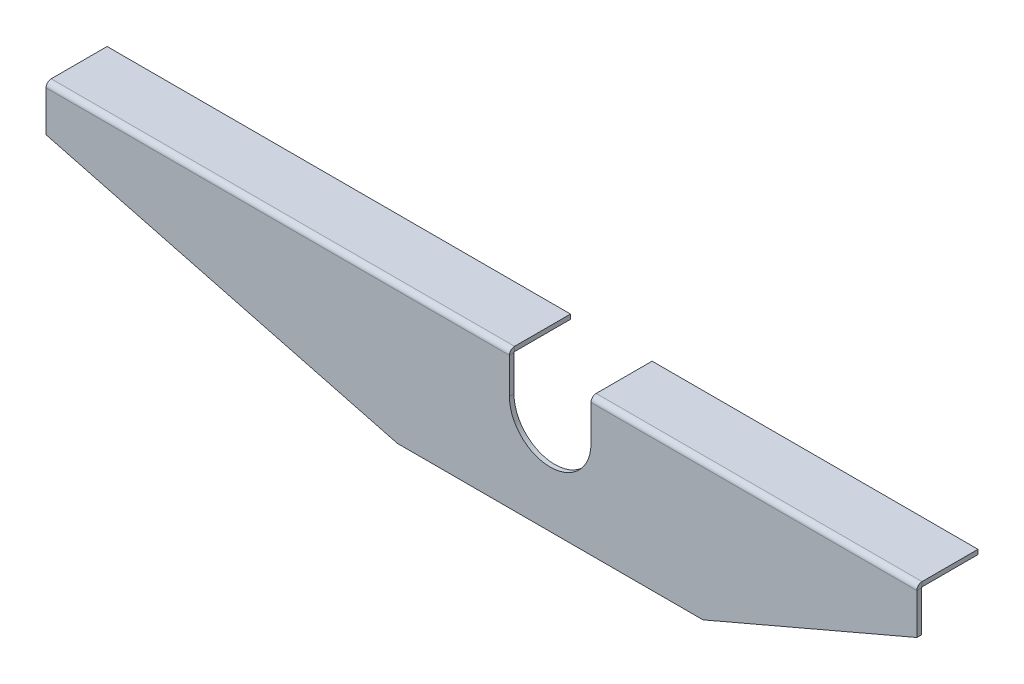
ISO-10303-21;
HEADER;
FILE_DESCRIPTION(('STEP AP214'),'2;1');
FILE_NAME('part.step','',(''),(''),'','','');
FILE_SCHEMA(('AUTOMOTIVE_DESIGN { 1 0 10303 214 1 1 1 1 }'));
ENDSEC;
DATA;
#1=APPLICATION_CONTEXT('core data for automotive mechanical design processes');
#2=APPLICATION_PROTOCOL_DEFINITION('international standard','automotive_design',2000,#1);
#3=PRODUCT_CONTEXT('',#1,'mechanical');
#4=PRODUCT('Part','Part','',(#3));
#5=PRODUCT_RELATED_PRODUCT_CATEGORY('part','',(#4));
#6=PRODUCT_DEFINITION_FORMATION('','',#4);
#7=PRODUCT_DEFINITION_CONTEXT('part definition',#1,'design');
#8=PRODUCT_DEFINITION('design','',#6,#7);
#9=PRODUCT_DEFINITION_SHAPE('','',#8);
#10=(LENGTH_UNIT() NAMED_UNIT(*) SI_UNIT(.MILLI.,.METRE.));
#11=(NAMED_UNIT(*) PLANE_ANGLE_UNIT() SI_UNIT($,.RADIAN.));
#12=(NAMED_UNIT(*) SI_UNIT($,.STERADIAN.) SOLID_ANGLE_UNIT());
#13=UNCERTAINTY_MEASURE_WITH_UNIT(LENGTH_MEASURE(1.E-05),#10,'distance_accuracy_value','');
#14=(GEOMETRIC_REPRESENTATION_CONTEXT(3) GLOBAL_UNCERTAINTY_ASSIGNED_CONTEXT((#13)) GLOBAL_UNIT_ASSIGNED_CONTEXT((#10,
#11,#12)) REPRESENTATION_CONTEXT('',''));
#15=CARTESIAN_POINT('',(0.,0.,0.));
#16=DIRECTION('',(0.,0.,1.));
#17=DIRECTION('',(1.,0.,0.));
#18=AXIS2_PLACEMENT_3D('',#15,#16,#17);
#19=CARTESIAN_POINT('',(0.,0.,-1.5));
#20=DIRECTION('',(0.,0.,1.));
#21=DIRECTION('',(1.,0.,0.));
#22=AXIS2_PLACEMENT_3D('',#19,#20,#21);
#23=PLANE('',#22);
#24=DIRECTION('',(1.,0.,0.));
#25=VECTOR('',#24,1.);
#26=CARTESIAN_POINT('',(120.,11.65,-1.5));
#27=LINE('',#26,#25);
#28=CARTESIAN_POINT('',(120.,11.65,-1.5));
#29=VERTEX_POINT('',#28);
#30=CARTESIAN_POINT('',(13.35,11.65,-1.5));
#31=VERTEX_POINT('',#30);
#32=EDGE_CURVE('E590',#29,#31,#27,.F.);
#33=ORIENTED_EDGE('',*,*,#32,.F.);
#34=DIRECTION('',(0.,1.,0.));
#35=VECTOR('',#34,1.);
#36=CARTESIAN_POINT('',(120.,13.35,-1.5));
#37=LINE('',#36,#35);
#38=CARTESIAN_POINT('',(120.,-1.65,-1.5));
#39=VERTEX_POINT('',#38);
#40=EDGE_CURVE('E171',#39,#29,#37,.T.);
#41=ORIENTED_EDGE('',*,*,#40,.F.);
#42=DIRECTION('',(0.919145030018058,0.393919298579168,0.));
#43=VECTOR('',#42,1.);
#44=CARTESIAN_POINT('',(120.,-1.65,-1.5));
#45=LINE('',#44,#43);
#46=CARTESIAN_POINT('',(50.,-31.65,-1.5));
#47=VERTEX_POINT('',#46);
#48=EDGE_CURVE('E154',#47,#39,#45,.T.);
#49=ORIENTED_EDGE('',*,*,#48,.F.);
#50=DIRECTION('',(1.,0.,0.));
#51=VECTOR('',#50,1.);
#52=CARTESIAN_POINT('',(50.,-31.65,-1.5));
#53=LINE('',#52,#51);
#54=CARTESIAN_POINT('',(-50.,-31.65,-1.5));
#55=VERTEX_POINT('',#54);
#56=EDGE_CURVE('E168',#55,#47,#53,.T.);
#57=ORIENTED_EDGE('',*,*,#56,.F.);
#58=DIRECTION('',(0.967617272396844,-0.252421897147003,0.));
#59=VECTOR('',#58,1.);
#60=CARTESIAN_POINT('',(-50.,-31.65,-1.5));
#61=LINE('',#60,#59);
#62=CARTESIAN_POINT('',(-165.,-1.65,-1.5));
#63=VERTEX_POINT('',#62);
#64=EDGE_CURVE('E174',#63,#55,#61,.T.);
#65=ORIENTED_EDGE('',*,*,#64,.F.);
#66=DIRECTION('',(0.,-1.,0.));
#67=VECTOR('',#66,1.);
#68=CARTESIAN_POINT('',(-165.,-1.65,-1.5));
#69=LINE('',#68,#67);
#70=CARTESIAN_POINT('',(-165.,11.65,-1.5));
#71=VERTEX_POINT('',#70);
#72=EDGE_CURVE('E176',#71,#63,#69,.T.);
#73=ORIENTED_EDGE('',*,*,#72,.F.);
#74=DIRECTION('',(1.,0.,0.));
#75=VECTOR('',#74,1.);
#76=CARTESIAN_POINT('',(-13.35,11.65,-1.5));
#77=LINE('',#76,#75);
#78=CARTESIAN_POINT('',(-13.35,11.65,-1.5));
#79=VERTEX_POINT('',#78);
#80=EDGE_CURVE('E647',#79,#71,#77,.F.);
#81=ORIENTED_EDGE('',*,*,#80,.F.);
#82=DIRECTION('',(0.,1.,0.));
#83=VECTOR('',#82,1.);
#84=CARTESIAN_POINT('',(-13.35,13.35,-1.5));
#85=LINE('',#84,#83);
#86=CARTESIAN_POINT('',(-13.35,0.,-1.5));
#87=VERTEX_POINT('',#86);
#88=EDGE_CURVE('E655',#87,#79,#85,.T.);
#89=ORIENTED_EDGE('',*,*,#88,.F.);
#90=CARTESIAN_POINT('',(0.,0.,-1.5));
#91=DIRECTION('',(0.,0.,-1.));
#92=DIRECTION('',(1.,0.,0.));
#93=AXIS2_PLACEMENT_3D('',#90,#91,#92);
#94=CIRCLE('',#93,13.35);
#95=CARTESIAN_POINT('',(13.35,0.,-1.5));
#96=VERTEX_POINT('',#95);
#97=EDGE_CURVE('E199',#96,#87,#94,.T.);
#98=ORIENTED_EDGE('',*,*,#97,.F.);
#99=DIRECTION('',(0.,-1.,0.));
#100=VECTOR('',#99,1.);
#101=CARTESIAN_POINT('',(13.35,0.,-1.5));
#102=LINE('',#101,#100);
#103=EDGE_CURVE('E103',#31,#96,#102,.T.);
#104=ORIENTED_EDGE('',*,*,#103,.F.);
#105=EDGE_LOOP('',(#33,#41,#49,#57,#65,#73,#81,#89,#98,#104));
#106=FACE_BOUND('',#105,.T.);
#107=ADVANCED_FACE('F78',(#106),#23,.F.);
#108=CARTESIAN_POINT('',(0.,0.,0.));
#109=DIRECTION('',(0.,0.,1.));
#110=DIRECTION('',(1.,0.,0.));
#111=AXIS2_PLACEMENT_3D('',#108,#109,#110);
#112=PLANE('',#111);
#113=DIRECTION('',(0.,1.,0.));
#114=VECTOR('',#113,1.);
#115=CARTESIAN_POINT('',(120.,13.35,0.));
#116=LINE('',#115,#114);
#117=CARTESIAN_POINT('',(120.,-1.65,0.));
#118=VERTEX_POINT('',#117);
#119=CARTESIAN_POINT('',(120.,11.65,0.));
#120=VERTEX_POINT('',#119);
#121=EDGE_CURVE('E196',#118,#120,#116,.T.);
#122=ORIENTED_EDGE('',*,*,#121,.T.);
#123=DIRECTION('',(1.,0.,0.));
#124=VECTOR('',#123,1.);
#125=CARTESIAN_POINT('',(120.,11.65,0.));
#126=LINE('',#125,#124);
#127=CARTESIAN_POINT('',(13.35,11.65,0.));
#128=VERTEX_POINT('',#127);
#129=EDGE_CURVE('E578',#120,#128,#126,.F.);
#130=ORIENTED_EDGE('',*,*,#129,.T.);
#131=DIRECTION('',(0.,-1.,0.));
#132=VECTOR('',#131,1.);
#133=CARTESIAN_POINT('',(13.35,0.,0.));
#134=LINE('',#133,#132);
#135=CARTESIAN_POINT('',(13.35,0.,0.));
#136=VERTEX_POINT('',#135);
#137=EDGE_CURVE('E132',#128,#136,#134,.T.);
#138=ORIENTED_EDGE('',*,*,#137,.T.);
#139=CARTESIAN_POINT('',(0.,0.,0.));
#140=DIRECTION('',(0.,0.,-1.));
#141=DIRECTION('',(1.,0.,0.));
#142=AXIS2_PLACEMENT_3D('',#139,#140,#141);
#143=CIRCLE('',#142,13.35);
#144=CARTESIAN_POINT('',(-13.35,0.,0.));
#145=VERTEX_POINT('',#144);
#146=EDGE_CURVE('E182',#136,#145,#143,.T.);
#147=ORIENTED_EDGE('',*,*,#146,.T.);
#148=DIRECTION('',(0.,1.,0.));
#149=VECTOR('',#148,1.);
#150=CARTESIAN_POINT('',(-13.35,13.35,0.));
#151=LINE('',#150,#149);
#152=CARTESIAN_POINT('',(-13.35,11.65,0.));
#153=VERTEX_POINT('',#152);
#154=EDGE_CURVE('E184',#145,#153,#151,.T.);
#155=ORIENTED_EDGE('',*,*,#154,.T.);
#156=DIRECTION('',(1.,0.,0.));
#157=VECTOR('',#156,1.);
#158=CARTESIAN_POINT('',(-13.35,11.65,0.));
#159=LINE('',#158,#157);
#160=CARTESIAN_POINT('',(-165.,11.65,0.));
#161=VERTEX_POINT('',#160);
#162=EDGE_CURVE('E638',#153,#161,#159,.F.);
#163=ORIENTED_EDGE('',*,*,#162,.T.);
#164=DIRECTION('',(0.,-1.,0.));
#165=VECTOR('',#164,1.);
#166=CARTESIAN_POINT('',(-165.,-1.65,0.));
#167=LINE('',#166,#165);
#168=CARTESIAN_POINT('',(-165.,-1.65,0.));
#169=VERTEX_POINT('',#168);
#170=EDGE_CURVE('E188',#161,#169,#167,.T.);
#171=ORIENTED_EDGE('',*,*,#170,.T.);
#172=DIRECTION('',(0.967617272396844,-0.252421897147003,0.));
#173=VECTOR('',#172,1.);
#174=CARTESIAN_POINT('',(-50.,-31.65,0.));
#175=LINE('',#174,#173);
#176=CARTESIAN_POINT('',(-50.,-31.65,0.));
#177=VERTEX_POINT('',#176);
#178=EDGE_CURVE('E190',#169,#177,#175,.T.);
#179=ORIENTED_EDGE('',*,*,#178,.T.);
#180=DIRECTION('',(1.,0.,0.));
#181=VECTOR('',#180,1.);
#182=CARTESIAN_POINT('',(50.,-31.65,0.));
#183=LINE('',#182,#181);
#184=CARTESIAN_POINT('',(50.,-31.65,0.));
#185=VERTEX_POINT('',#184);
#186=EDGE_CURVE('E193',#177,#185,#183,.T.);
#187=ORIENTED_EDGE('',*,*,#186,.T.);
#188=DIRECTION('',(0.919145030018058,0.393919298579168,0.));
#189=VECTOR('',#188,1.);
#190=CARTESIAN_POINT('',(120.,-1.65,0.));
#191=LINE('',#190,#189);
#192=EDGE_CURVE('E156',#185,#118,#191,.T.);
#193=ORIENTED_EDGE('',*,*,#192,.T.);
#194=EDGE_LOOP('',(#122,#130,#138,#147,#155,#163,#171,#179,#187,#193));
#195=FACE_BOUND('',#194,.T.);
#196=ADVANCED_FACE('F218',(#195),#112,.T.);
#197=CARTESIAN_POINT('',(120.,13.35,-1.5));
#198=DIRECTION('',(1.,0.,0.));
#199=DIRECTION('',(0.,0.,-1.));
#200=AXIS2_PLACEMENT_3D('',#197,#198,#199);
#201=PLANE('',#200);
#202=ORIENTED_EDGE('',*,*,#40,.T.);
#203=DIRECTION('',(0.,0.,1.));
#204=VECTOR('',#203,1.);
#205=CARTESIAN_POINT('',(120.,11.65,-1.5));
#206=LINE('',#205,#204);
#207=EDGE_CURVE('E584',#29,#120,#206,.T.);
#208=ORIENTED_EDGE('',*,*,#207,.T.);
#209=ORIENTED_EDGE('',*,*,#121,.F.);
#210=DIRECTION('',(0.,0.,1.));
#211=VECTOR('',#210,1.);
#212=CARTESIAN_POINT('',(120.,-1.65,-1.5));
#213=LINE('',#212,#211);
#214=EDGE_CURVE('E87',#39,#118,#213,.T.);
#215=ORIENTED_EDGE('',*,*,#214,.F.);
#216=EDGE_LOOP('',(#202,#208,#209,#215));
#217=FACE_BOUND('',#216,.T.);
#218=ADVANCED_FACE('F222',(#217),#201,.T.);
#219=CARTESIAN_POINT('',(-13.35,13.35,-1.5));
#220=DIRECTION('',(1.,0.,0.));
#221=DIRECTION('',(0.,0.,-1.));
#222=AXIS2_PLACEMENT_3D('',#219,#220,#221);
#223=PLANE('',#222);
#224=ORIENTED_EDGE('',*,*,#88,.T.);
#225=DIRECTION('',(0.,0.,1.));
#226=VECTOR('',#225,1.);
#227=CARTESIAN_POINT('',(-13.35,11.65,-1.5));
#228=LINE('',#227,#226);
#229=EDGE_CURVE('E216',#79,#153,#228,.T.);
#230=ORIENTED_EDGE('',*,*,#229,.T.);
#231=ORIENTED_EDGE('',*,*,#154,.F.);
#232=DIRECTION('',(0.,0.,1.));
#233=VECTOR('',#232,1.);
#234=CARTESIAN_POINT('',(-13.35,0.,-1.5));
#235=LINE('',#234,#233);
#236=EDGE_CURVE('E82',#87,#145,#235,.T.);
#237=ORIENTED_EDGE('',*,*,#236,.F.);
#238=EDGE_LOOP('',(#224,#230,#231,#237));
#239=FACE_BOUND('',#238,.T.);
#240=ADVANCED_FACE('F213',(#239),#223,.T.);
#241=CARTESIAN_POINT('',(0.,0.,-1.5));
#242=DIRECTION('',(0.,0.,1.));
#243=DIRECTION('',(1.,0.,0.));
#244=AXIS2_PLACEMENT_3D('',#241,#242,#243);
#245=CYLINDRICAL_SURFACE('',#244,13.35);
#246=ORIENTED_EDGE('',*,*,#146,.F.);
#247=DIRECTION('',(0.,0.,1.));
#248=VECTOR('',#247,1.);
#249=CARTESIAN_POINT('',(13.35,0.,-1.5));
#250=LINE('',#249,#248);
#251=EDGE_CURVE('E13',#96,#136,#250,.T.);
#252=ORIENTED_EDGE('',*,*,#251,.F.);
#253=ORIENTED_EDGE('',*,*,#97,.T.);
#254=ORIENTED_EDGE('',*,*,#236,.T.);
#255=EDGE_LOOP('',(#246,#252,#253,#254));
#256=FACE_BOUND('',#255,.T.);
#257=ADVANCED_FACE('F80',(#256),#245,.F.);
#258=CARTESIAN_POINT('',(13.35,0.,-1.5));
#259=DIRECTION('',(-1.,0.,0.));
#260=DIRECTION('',(0.,0.,1.));
#261=AXIS2_PLACEMENT_3D('',#258,#259,#260);
#262=PLANE('',#261);
#263=DIRECTION('',(0.,0.,1.));
#264=VECTOR('',#263,1.);
#265=CARTESIAN_POINT('',(13.35,11.65,-1.5));
#266=LINE('',#265,#264);
#267=EDGE_CURVE('E596',#31,#128,#266,.T.);
#268=ORIENTED_EDGE('',*,*,#267,.F.);
#269=ORIENTED_EDGE('',*,*,#103,.T.);
#270=ORIENTED_EDGE('',*,*,#251,.T.);
#271=ORIENTED_EDGE('',*,*,#137,.F.);
#272=EDGE_LOOP('',(#268,#269,#270,#271));
#273=FACE_BOUND('',#272,.T.);
#274=ADVANCED_FACE('F233',(#273),#262,.T.);
#275=CARTESIAN_POINT('',(120.,-1.65,-1.5));
#276=DIRECTION('',(0.393919298579168,-0.919145030018058,0.));
#277=DIRECTION('',(0.919145030018058,0.393919298579168,0.));
#278=AXIS2_PLACEMENT_3D('',#275,#276,#277);
#279=PLANE('',#278);
#280=ORIENTED_EDGE('',*,*,#192,.F.);
#281=DIRECTION('',(0.,0.,1.));
#282=VECTOR('',#281,1.);
#283=CARTESIAN_POINT('',(50.,-31.65,-1.5));
#284=LINE('',#283,#282);
#285=EDGE_CURVE('E151',#47,#185,#284,.T.);
#286=ORIENTED_EDGE('',*,*,#285,.F.);
#287=ORIENTED_EDGE('',*,*,#48,.T.);
#288=ORIENTED_EDGE('',*,*,#214,.T.);
#289=EDGE_LOOP('',(#280,#286,#287,#288));
#290=FACE_BOUND('',#289,.T.);
#291=ADVANCED_FACE('F153',(#290),#279,.T.);
#292=CARTESIAN_POINT('',(50.,-31.65,-1.5));
#293=DIRECTION('',(0.,-1.,0.));
#294=DIRECTION('',(1.,0.,0.));
#295=AXIS2_PLACEMENT_3D('',#292,#293,#294);
#296=PLANE('',#295);
#297=ORIENTED_EDGE('',*,*,#186,.F.);
#298=DIRECTION('',(0.,0.,1.));
#299=VECTOR('',#298,1.);
#300=CARTESIAN_POINT('',(-50.,-31.65,-1.5));
#301=LINE('',#300,#299);
#302=EDGE_CURVE('E161',#55,#177,#301,.T.);
#303=ORIENTED_EDGE('',*,*,#302,.F.);
#304=ORIENTED_EDGE('',*,*,#56,.T.);
#305=ORIENTED_EDGE('',*,*,#285,.T.);
#306=EDGE_LOOP('',(#297,#303,#304,#305));
#307=FACE_BOUND('',#306,.T.);
#308=ADVANCED_FACE('F173',(#307),#296,.T.);
#309=CARTESIAN_POINT('',(-50.,-31.65,-1.5));
#310=DIRECTION('',(-0.252421897147003,-0.967617272396844,0.));
#311=DIRECTION('',(0.967617272396844,-0.252421897147003,0.));
#312=AXIS2_PLACEMENT_3D('',#309,#310,#311);
#313=PLANE('',#312);
#314=ORIENTED_EDGE('',*,*,#178,.F.);
#315=DIRECTION('',(0.,0.,1.));
#316=VECTOR('',#315,1.);
#317=CARTESIAN_POINT('',(-165.,-1.65,-1.5));
#318=LINE('',#317,#316);
#319=EDGE_CURVE('E202',#63,#169,#318,.T.);
#320=ORIENTED_EDGE('',*,*,#319,.F.);
#321=ORIENTED_EDGE('',*,*,#64,.T.);
#322=ORIENTED_EDGE('',*,*,#302,.T.);
#323=EDGE_LOOP('',(#314,#320,#321,#322));
#324=FACE_BOUND('',#323,.T.);
#325=ADVANCED_FACE('F240',(#324),#313,.T.);
#326=CARTESIAN_POINT('',(-165.,-1.65,-1.5));
#327=DIRECTION('',(-1.,0.,0.));
#328=DIRECTION('',(0.,0.,1.));
#329=AXIS2_PLACEMENT_3D('',#326,#327,#328);
#330=PLANE('',#329);
#331=DIRECTION('',(0.,0.,1.));
#332=VECTOR('',#331,1.);
#333=CARTESIAN_POINT('',(-165.,11.65,-1.5));
#334=LINE('',#333,#332);
#335=EDGE_CURVE('E185',#71,#161,#334,.T.);
#336=ORIENTED_EDGE('',*,*,#335,.F.);
#337=ORIENTED_EDGE('',*,*,#72,.T.);
#338=ORIENTED_EDGE('',*,*,#319,.T.);
#339=ORIENTED_EDGE('',*,*,#170,.F.);
#340=EDGE_LOOP('',(#336,#337,#338,#339));
#341=FACE_BOUND('',#340,.T.);
#342=ADVANCED_FACE('F243',(#341),#330,.T.);
#343=CARTESIAN_POINT('',(-165.,11.65,-1.7));
#344=DIRECTION('',(-1.,0.,0.));
#345=DIRECTION('',(0.,0.,1.));
#346=AXIS2_PLACEMENT_3D('',#343,#344,#345);
#347=PLANE('',#346);
#348=DIRECTION('',(0.,1.,0.));
#349=VECTOR('',#348,1.);
#350=CARTESIAN_POINT('',(-165.,13.35,-1.69999999999999));
#351=LINE('',#350,#349);
#352=CARTESIAN_POINT('',(-165.,11.85,-1.7));
#353=VERTEX_POINT('',#352);
#354=CARTESIAN_POINT('',(-165.,13.35,-1.69999999999999));
#355=VERTEX_POINT('',#354);
#356=EDGE_CURVE('E599',#353,#355,#351,.T.);
#357=ORIENTED_EDGE('',*,*,#356,.F.);
#358=CARTESIAN_POINT('',(-165.,11.65,-1.7));
#359=DIRECTION('',(1.,0.,0.));
#360=DIRECTION('',(0.,0.,-1.));
#361=AXIS2_PLACEMENT_3D('',#358,#359,#360);
#362=CIRCLE('',#361,0.200000000000002);
#363=EDGE_CURVE('E644',#71,#353,#362,.F.);
#364=ORIENTED_EDGE('',*,*,#363,.F.);
#365=ORIENTED_EDGE('',*,*,#335,.T.);
#366=CARTESIAN_POINT('',(-165.,11.65,-1.7));
#367=DIRECTION('',(1.,0.,0.));
#368=DIRECTION('',(0.,0.,-1.));
#369=AXIS2_PLACEMENT_3D('',#366,#367,#368);
#370=CIRCLE('',#369,1.7);
#371=EDGE_CURVE('E95',#161,#355,#370,.F.);
#372=ORIENTED_EDGE('',*,*,#371,.T.);
#373=EDGE_LOOP('',(#357,#364,#365,#372));
#374=FACE_BOUND('',#373,.T.);
#375=ADVANCED_FACE('F246',(#374),#347,.T.);
#376=CARTESIAN_POINT('',(-13.35,11.65,-1.7));
#377=DIRECTION('',(-1.,0.,0.));
#378=DIRECTION('',(0.,0.,1.));
#379=AXIS2_PLACEMENT_3D('',#376,#377,#378);
#380=PLANE('',#379);
#381=CARTESIAN_POINT('',(-13.35,11.65,-1.7));
#382=DIRECTION('',(1.,0.,0.));
#383=DIRECTION('',(0.,0.,-1.));
#384=AXIS2_PLACEMENT_3D('',#381,#382,#383);
#385=CIRCLE('',#384,0.200000000000002);
#386=CARTESIAN_POINT('',(-13.35,11.85,-1.7));
#387=VERTEX_POINT('',#386);
#388=EDGE_CURVE('E605',#387,#79,#385,.T.);
#389=ORIENTED_EDGE('',*,*,#388,.F.);
#390=DIRECTION('',(0.,1.,0.));
#391=VECTOR('',#390,1.);
#392=CARTESIAN_POINT('',(-13.35,11.85,-1.7));
#393=LINE('',#392,#391);
#394=CARTESIAN_POINT('',(-13.35,13.35,-1.69999999999999));
#395=VERTEX_POINT('',#394);
#396=EDGE_CURVE('E630',#387,#395,#393,.T.);
#397=ORIENTED_EDGE('',*,*,#396,.T.);
#398=CARTESIAN_POINT('',(-13.35,11.65,-1.7));
#399=DIRECTION('',(1.,0.,0.));
#400=DIRECTION('',(0.,0.,-1.));
#401=AXIS2_PLACEMENT_3D('',#398,#399,#400);
#402=CIRCLE('',#401,1.7);
#403=EDGE_CURVE('E640',#395,#153,#402,.T.);
#404=ORIENTED_EDGE('',*,*,#403,.T.);
#405=ORIENTED_EDGE('',*,*,#229,.F.);
#406=EDGE_LOOP('',(#389,#397,#404,#405));
#407=FACE_BOUND('',#406,.T.);
#408=ADVANCED_FACE('F280',(#407),#380,.F.);
#409=CARTESIAN_POINT('',(-13.35,11.65,-1.7));
#410=DIRECTION('',(1.,0.,0.));
#411=DIRECTION('',(0.,1.,0.));
#412=AXIS2_PLACEMENT_3D('',#409,#410,#411);
#413=CYLINDRICAL_SURFACE('',#412,1.7);
#414=ORIENTED_EDGE('',*,*,#162,.F.);
#415=ORIENTED_EDGE('',*,*,#403,.F.);
#416=DIRECTION('',(1.,0.,0.));
#417=VECTOR('',#416,1.);
#418=CARTESIAN_POINT('',(0.,13.35,-1.7));
#419=LINE('',#418,#417);
#420=EDGE_CURVE('E627',#355,#395,#419,.T.);
#421=ORIENTED_EDGE('',*,*,#420,.F.);
#422=ORIENTED_EDGE('',*,*,#371,.F.);
#423=EDGE_LOOP('',(#414,#415,#421,#422));
#424=FACE_BOUND('',#423,.T.);
#425=ADVANCED_FACE('F288',(#424),#413,.T.);
#426=CARTESIAN_POINT('',(-13.35,11.65,-1.7));
#427=DIRECTION('',(1.,0.,0.));
#428=DIRECTION('',(0.,1.,0.));
#429=AXIS2_PLACEMENT_3D('',#426,#427,#428);
#430=CYLINDRICAL_SURFACE('',#429,0.200000000000002);
#431=ORIENTED_EDGE('',*,*,#80,.T.);
#432=ORIENTED_EDGE('',*,*,#363,.T.);
#433=DIRECTION('',(-1.,0.,0.));
#434=VECTOR('',#433,1.);
#435=CARTESIAN_POINT('',(-165.,11.85,-1.7));
#436=LINE('',#435,#434);
#437=EDGE_CURVE('E633',#353,#387,#436,.F.);
#438=ORIENTED_EDGE('',*,*,#437,.T.);
#439=ORIENTED_EDGE('',*,*,#388,.T.);
#440=EDGE_LOOP('',(#431,#432,#438,#439));
#441=FACE_BOUND('',#440,.T.);
#442=ADVANCED_FACE('F295',(#441),#430,.F.);
#443=CARTESIAN_POINT('',(-13.35,13.35,-1.49999999999999));
#444=DIRECTION('',(1.,0.,0.));
#445=DIRECTION('',(0.,0.,-1.));
#446=AXIS2_PLACEMENT_3D('',#443,#444,#445);
#447=PLANE('',#446);
#448=DIRECTION('',(0.,0.,1.));
#449=VECTOR('',#448,1.);
#450=CARTESIAN_POINT('',(-13.35,13.35,-1.49999999999999));
#451=LINE('',#450,#449);
#452=CARTESIAN_POINT('',(-13.35,13.3500000000001,-20.));
#453=VERTEX_POINT('',#452);
#454=EDGE_CURVE('E609',#453,#395,#451,.T.);
#455=ORIENTED_EDGE('',*,*,#454,.T.);
#456=ORIENTED_EDGE('',*,*,#396,.F.);
#457=DIRECTION('',(0.,0.,-1.));
#458=VECTOR('',#457,1.);
#459=CARTESIAN_POINT('',(-13.35,11.85,0.));
#460=LINE('',#459,#458);
#461=CARTESIAN_POINT('',(-13.35,11.8500000000001,-20.));
#462=VERTEX_POINT('',#461);
#463=EDGE_CURVE('E618',#462,#387,#460,.F.);
#464=ORIENTED_EDGE('',*,*,#463,.F.);
#465=DIRECTION('',(0.,-1.,0.));
#466=VECTOR('',#465,1.);
#467=CARTESIAN_POINT('',(-13.35,13.3500000000001,-20.));
#468=LINE('',#467,#466);
#469=EDGE_CURVE('E602',#453,#462,#468,.T.);
#470=ORIENTED_EDGE('',*,*,#469,.F.);
#471=EDGE_LOOP('',(#455,#456,#464,#470));
#472=FACE_BOUND('',#471,.T.);
#473=ADVANCED_FACE('F302',(#472),#447,.T.);
#474=CARTESIAN_POINT('',(-165.,13.3500000000001,-20.));
#475=DIRECTION('',(-1.,0.,0.));
#476=DIRECTION('',(0.,-1.,0.));
#477=AXIS2_PLACEMENT_3D('',#474,#475,#476);
#478=PLANE('',#477);
#479=DIRECTION('',(0.,0.,1.));
#480=VECTOR('',#479,1.);
#481=CARTESIAN_POINT('',(-165.,11.85,0.));
#482=LINE('',#481,#480);
#483=CARTESIAN_POINT('',(-165.,11.8500000000001,-20.));
#484=VERTEX_POINT('',#483);
#485=EDGE_CURVE('E624',#353,#484,#482,.F.);
#486=ORIENTED_EDGE('',*,*,#485,.F.);
#487=ORIENTED_EDGE('',*,*,#356,.T.);
#488=DIRECTION('',(0.,0.,-1.));
#489=VECTOR('',#488,1.);
#490=CARTESIAN_POINT('',(-165.,13.3500000000001,-20.));
#491=LINE('',#490,#489);
#492=CARTESIAN_POINT('',(-165.,13.3500000000001,-20.));
#493=VERTEX_POINT('',#492);
#494=EDGE_CURVE('E615',#355,#493,#491,.T.);
#495=ORIENTED_EDGE('',*,*,#494,.T.);
#496=DIRECTION('',(0.,-1.,0.));
#497=VECTOR('',#496,1.);
#498=CARTESIAN_POINT('',(-165.,13.3500000000001,-20.));
#499=LINE('',#498,#497);
#500=EDGE_CURVE('E606',#493,#484,#499,.T.);
#501=ORIENTED_EDGE('',*,*,#500,.T.);
#502=EDGE_LOOP('',(#486,#487,#495,#501));
#503=FACE_BOUND('',#502,.T.);
#504=ADVANCED_FACE('F310',(#503),#478,.T.);
#505=CARTESIAN_POINT('',(0.,13.35,0.));
#506=DIRECTION('',(0.,1.,0.));
#507=DIRECTION('',(0.,0.,1.));
#508=AXIS2_PLACEMENT_3D('',#505,#506,#507);
#509=PLANE('',#508);
#510=ORIENTED_EDGE('',*,*,#494,.F.);
#511=ORIENTED_EDGE('',*,*,#420,.T.);
#512=ORIENTED_EDGE('',*,*,#454,.F.);
#513=DIRECTION('',(1.,0.,0.));
#514=VECTOR('',#513,1.);
#515=CARTESIAN_POINT('',(-13.35,13.3500000000001,-20.));
#516=LINE('',#515,#514);
#517=EDGE_CURVE('E612',#493,#453,#516,.T.);
#518=ORIENTED_EDGE('',*,*,#517,.F.);
#519=EDGE_LOOP('',(#510,#511,#512,#518));
#520=FACE_BOUND('',#519,.T.);
#521=ADVANCED_FACE('F318',(#520),#509,.T.);
#522=CARTESIAN_POINT('',(0.,11.85,0.));
#523=DIRECTION('',(0.,1.,0.));
#524=DIRECTION('',(0.,0.,1.));
#525=AXIS2_PLACEMENT_3D('',#522,#523,#524);
#526=PLANE('',#525);
#527=ORIENTED_EDGE('',*,*,#437,.F.);
#528=ORIENTED_EDGE('',*,*,#485,.T.);
#529=DIRECTION('',(-1.,0.,0.));
#530=VECTOR('',#529,1.);
#531=CARTESIAN_POINT('',(0.,11.8500000000001,-20.));
#532=LINE('',#531,#530);
#533=EDGE_CURVE('E621',#484,#462,#532,.F.);
#534=ORIENTED_EDGE('',*,*,#533,.T.);
#535=ORIENTED_EDGE('',*,*,#463,.T.);
#536=EDGE_LOOP('',(#527,#528,#534,#535));
#537=FACE_BOUND('',#536,.T.);
#538=ADVANCED_FACE('F326',(#537),#526,.F.);
#539=CARTESIAN_POINT('',(-13.35,13.3500000000001,-20.));
#540=DIRECTION('',(0.,0.,-1.));
#541=DIRECTION('',(0.,1.,0.));
#542=AXIS2_PLACEMENT_3D('',#539,#540,#541);
#543=PLANE('',#542);
#544=ORIENTED_EDGE('',*,*,#533,.F.);
#545=ORIENTED_EDGE('',*,*,#500,.F.);
#546=ORIENTED_EDGE('',*,*,#517,.T.);
#547=ORIENTED_EDGE('',*,*,#469,.T.);
#548=EDGE_LOOP('',(#544,#545,#546,#547));
#549=FACE_BOUND('',#548,.T.);
#550=ADVANCED_FACE('F334',(#549),#543,.T.);
#551=CARTESIAN_POINT('',(13.35,11.65,-1.7));
#552=DIRECTION('',(-1.,0.,0.));
#553=DIRECTION('',(0.,0.,1.));
#554=AXIS2_PLACEMENT_3D('',#551,#552,#553);
#555=PLANE('',#554);
#556=DIRECTION('',(0.,1.,0.));
#557=VECTOR('',#556,1.);
#558=CARTESIAN_POINT('',(13.35,13.35,-1.69999999999999));
#559=LINE('',#558,#557);
#560=CARTESIAN_POINT('',(13.35,11.85,-1.7));
#561=VERTEX_POINT('',#560);
#562=CARTESIAN_POINT('',(13.35,13.35,-1.69999999999999));
#563=VERTEX_POINT('',#562);
#564=EDGE_CURVE('E575',#561,#563,#559,.T.);
#565=ORIENTED_EDGE('',*,*,#564,.F.);
#566=CARTESIAN_POINT('',(13.35,11.65,-1.7));
#567=DIRECTION('',(1.,0.,0.));
#568=DIRECTION('',(0.,0.,-1.));
#569=AXIS2_PLACEMENT_3D('',#566,#567,#568);
#570=CIRCLE('',#569,0.200000000000001);
#571=EDGE_CURVE('E587',#31,#561,#570,.F.);
#572=ORIENTED_EDGE('',*,*,#571,.F.);
#573=ORIENTED_EDGE('',*,*,#267,.T.);
#574=CARTESIAN_POINT('',(13.35,11.65,-1.7));
#575=DIRECTION('',(1.,0.,0.));
#576=DIRECTION('',(0.,0.,-1.));
#577=AXIS2_PLACEMENT_3D('',#574,#575,#576);
#578=CIRCLE('',#577,1.7);
#579=EDGE_CURVE('E580',#128,#563,#578,.F.);
#580=ORIENTED_EDGE('',*,*,#579,.T.);
#581=EDGE_LOOP('',(#565,#572,#573,#580));
#582=FACE_BOUND('',#581,.T.);
#583=ADVANCED_FACE('F342',(#582),#555,.T.);
#584=CARTESIAN_POINT('',(120.,11.65,-1.7));
#585=DIRECTION('',(-1.,0.,0.));
#586=DIRECTION('',(0.,0.,1.));
#587=AXIS2_PLACEMENT_3D('',#584,#585,#586);
#588=PLANE('',#587);
#589=CARTESIAN_POINT('',(120.,11.65,-1.7));
#590=DIRECTION('',(1.,0.,0.));
#591=DIRECTION('',(0.,0.,-1.));
#592=AXIS2_PLACEMENT_3D('',#589,#590,#591);
#593=CIRCLE('',#592,0.200000000000001);
#594=CARTESIAN_POINT('',(120.,11.85,-1.7));
#595=VERTEX_POINT('',#594);
#596=EDGE_CURVE('E593',#595,#29,#593,.T.);
#597=ORIENTED_EDGE('',*,*,#596,.F.);
#598=DIRECTION('',(0.,1.,0.));
#599=VECTOR('',#598,1.);
#600=CARTESIAN_POINT('',(120.,11.85,-1.7));
#601=LINE('',#600,#599);
#602=CARTESIAN_POINT('',(120.,13.35,-1.7));
#603=VERTEX_POINT('',#602);
#604=EDGE_CURVE('E569',#595,#603,#601,.T.);
#605=ORIENTED_EDGE('',*,*,#604,.T.);
#606=CARTESIAN_POINT('',(120.,11.65,-1.7));
#607=DIRECTION('',(1.,0.,0.));
#608=DIRECTION('',(0.,0.,-1.));
#609=AXIS2_PLACEMENT_3D('',#606,#607,#608);
#610=CIRCLE('',#609,1.7);
#611=EDGE_CURVE('E581',#603,#120,#610,.T.);
#612=ORIENTED_EDGE('',*,*,#611,.T.);
#613=ORIENTED_EDGE('',*,*,#207,.F.);
#614=EDGE_LOOP('',(#597,#605,#612,#613));
#615=FACE_BOUND('',#614,.T.);
#616=ADVANCED_FACE('F350',(#615),#588,.F.);
#617=CARTESIAN_POINT('',(120.,11.65,-1.7));
#618=DIRECTION('',(1.,0.,0.));
#619=DIRECTION('',(0.,1.,0.));
#620=AXIS2_PLACEMENT_3D('',#617,#618,#619);
#621=CYLINDRICAL_SURFACE('',#620,1.7);
#622=ORIENTED_EDGE('',*,*,#129,.F.);
#623=ORIENTED_EDGE('',*,*,#611,.F.);
#624=DIRECTION('',(1.,0.,0.));
#625=VECTOR('',#624,1.);
#626=CARTESIAN_POINT('',(0.,13.35,-1.69999999999999));
#627=LINE('',#626,#625);
#628=EDGE_CURVE('E563',#563,#603,#627,.T.);
#629=ORIENTED_EDGE('',*,*,#628,.F.);
#630=ORIENTED_EDGE('',*,*,#579,.F.);
#631=EDGE_LOOP('',(#622,#623,#629,#630));
#632=FACE_BOUND('',#631,.T.);
#633=ADVANCED_FACE('F358',(#632),#621,.T.);
#634=CARTESIAN_POINT('',(120.,11.65,-1.7));
#635=DIRECTION('',(1.,0.,0.));
#636=DIRECTION('',(0.,1.,0.));
#637=AXIS2_PLACEMENT_3D('',#634,#635,#636);
#638=CYLINDRICAL_SURFACE('',#637,0.200000000000001);
#639=ORIENTED_EDGE('',*,*,#32,.T.);
#640=ORIENTED_EDGE('',*,*,#571,.T.);
#641=DIRECTION('',(-1.,0.,0.));
#642=VECTOR('',#641,1.);
#643=CARTESIAN_POINT('',(13.3499999999999,11.85,-1.7));
#644=LINE('',#643,#642);
#645=EDGE_CURVE('E572',#561,#595,#644,.F.);
#646=ORIENTED_EDGE('',*,*,#645,.T.);
#647=ORIENTED_EDGE('',*,*,#596,.T.);
#648=EDGE_LOOP('',(#639,#640,#646,#647));
#649=FACE_BOUND('',#648,.T.);
#650=ADVANCED_FACE('F366',(#649),#638,.F.);
#651=CARTESIAN_POINT('',(120.,13.35,-1.49999999999999));
#652=DIRECTION('',(1.,0.,0.));
#653=DIRECTION('',(0.,1.,0.));
#654=AXIS2_PLACEMENT_3D('',#651,#652,#653);
#655=PLANE('',#654);
#656=DIRECTION('',(0.,0.,1.));
#657=VECTOR('',#656,1.);
#658=CARTESIAN_POINT('',(120.,13.35,-1.49999999999999));
#659=LINE('',#658,#657);
#660=CARTESIAN_POINT('',(120.,13.3500000000001,-20.));
#661=VERTEX_POINT('',#660);
#662=EDGE_CURVE('E715',#661,#603,#659,.T.);
#663=ORIENTED_EDGE('',*,*,#662,.T.);
#664=ORIENTED_EDGE('',*,*,#604,.F.);
#665=DIRECTION('',(0.,0.,-1.));
#666=VECTOR('',#665,1.);
#667=CARTESIAN_POINT('',(120.,11.85,0.));
#668=LINE('',#667,#666);
#669=CARTESIAN_POINT('',(120.,11.8500000000001,-20.));
#670=VERTEX_POINT('',#669);
#671=EDGE_CURVE('E558',#670,#595,#668,.F.);
#672=ORIENTED_EDGE('',*,*,#671,.F.);
#673=DIRECTION('',(0.,-1.,0.));
#674=VECTOR('',#673,1.);
#675=CARTESIAN_POINT('',(120.,13.3500000000001,-20.));
#676=LINE('',#675,#674);
#677=EDGE_CURVE('E553',#661,#670,#676,.T.);
#678=ORIENTED_EDGE('',*,*,#677,.F.);
#679=EDGE_LOOP('',(#663,#664,#672,#678));
#680=FACE_BOUND('',#679,.T.);
#681=ADVANCED_FACE('F374',(#680),#655,.T.);
#682=CARTESIAN_POINT('',(13.3499999999999,13.3500000000001,-20.));
#683=DIRECTION('',(-1.,0.,0.));
#684=DIRECTION('',(0.,0.,1.));
#685=AXIS2_PLACEMENT_3D('',#682,#683,#684);
#686=PLANE('',#685);
#687=DIRECTION('',(0.,0.,1.));
#688=VECTOR('',#687,1.);
#689=CARTESIAN_POINT('',(13.35,11.85,0.));
#690=LINE('',#689,#688);
#691=CARTESIAN_POINT('',(13.3499999999999,11.8500000000001,-20.));
#692=VERTEX_POINT('',#691);
#693=EDGE_CURVE('E559',#561,#692,#690,.F.);
#694=ORIENTED_EDGE('',*,*,#693,.F.);
#695=ORIENTED_EDGE('',*,*,#564,.T.);
#696=DIRECTION('',(0.,0.,-1.));
#697=VECTOR('',#696,1.);
#698=CARTESIAN_POINT('',(13.3499999999999,13.3500000000001,-20.));
#699=LINE('',#698,#697);
#700=CARTESIAN_POINT('',(13.3499999999999,13.3500000000001,-20.));
#701=VERTEX_POINT('',#700);
#702=EDGE_CURVE('E561',#563,#701,#699,.T.);
#703=ORIENTED_EDGE('',*,*,#702,.T.);
#704=DIRECTION('',(0.,-1.,0.));
#705=VECTOR('',#704,1.);
#706=CARTESIAN_POINT('',(13.3499999999999,13.3500000000001,-20.));
#707=LINE('',#706,#705);
#708=EDGE_CURVE('E549',#701,#692,#707,.T.);
#709=ORIENTED_EDGE('',*,*,#708,.T.);
#710=EDGE_LOOP('',(#694,#695,#703,#709));
#711=FACE_BOUND('',#710,.T.);
#712=ADVANCED_FACE('F382',(#711),#686,.T.);
#713=CARTESIAN_POINT('',(0.,13.35,0.));
#714=DIRECTION('',(0.,1.,0.));
#715=DIRECTION('',(0.,0.,1.));
#716=AXIS2_PLACEMENT_3D('',#713,#714,#715);
#717=PLANE('',#716);
#718=ORIENTED_EDGE('',*,*,#702,.F.);
#719=ORIENTED_EDGE('',*,*,#628,.T.);
#720=ORIENTED_EDGE('',*,*,#662,.F.);
#721=DIRECTION('',(1.,0.,0.));
#722=VECTOR('',#721,1.);
#723=CARTESIAN_POINT('',(120.,13.3500000000001,-20.));
#724=LINE('',#723,#722);
#725=EDGE_CURVE('E719',#701,#661,#724,.T.);
#726=ORIENTED_EDGE('',*,*,#725,.F.);
#727=EDGE_LOOP('',(#718,#719,#720,#726));
#728=FACE_BOUND('',#727,.T.);
#729=ADVANCED_FACE('F390',(#728),#717,.T.);
#730=CARTESIAN_POINT('',(0.,11.85,0.));
#731=DIRECTION('',(0.,1.,0.));
#732=DIRECTION('',(0.,0.,1.));
#733=AXIS2_PLACEMENT_3D('',#730,#731,#732);
#734=PLANE('',#733);
#735=ORIENTED_EDGE('',*,*,#645,.F.);
#736=ORIENTED_EDGE('',*,*,#693,.T.);
#737=DIRECTION('',(-1.,0.,0.));
#738=VECTOR('',#737,1.);
#739=CARTESIAN_POINT('',(0.,11.8500000000001,-20.));
#740=LINE('',#739,#738);
#741=EDGE_CURVE('E545',#692,#670,#740,.F.);
#742=ORIENTED_EDGE('',*,*,#741,.T.);
#743=ORIENTED_EDGE('',*,*,#671,.T.);
#744=EDGE_LOOP('',(#735,#736,#742,#743));
#745=FACE_BOUND('',#744,.T.);
#746=ADVANCED_FACE('F398',(#745),#734,.F.);
#747=CARTESIAN_POINT('',(120.,13.3500000000001,-20.));
#748=DIRECTION('',(0.,0.,-1.));
#749=DIRECTION('',(0.,1.,0.));
#750=AXIS2_PLACEMENT_3D('',#747,#748,#749);
#751=PLANE('',#750);
#752=ORIENTED_EDGE('',*,*,#741,.F.);
#753=ORIENTED_EDGE('',*,*,#708,.F.);
#754=ORIENTED_EDGE('',*,*,#725,.T.);
#755=ORIENTED_EDGE('',*,*,#677,.T.);
#756=EDGE_LOOP('',(#752,#753,#754,#755));
#757=FACE_BOUND('',#756,.T.);
#758=ADVANCED_FACE('F406',(#757),#751,.T.);
#759=CLOSED_SHELL('',(#107,#196,#218,#240,#257,#274,#291,#308,#325,#342,#375,#408,#425,#442,
#473,#504,#521,#538,#550,#583,#616,#633,#650,#681,#712,#729,#746,#758));
#760=MANIFOLD_SOLID_BREP('B2',#759);
#761=ADVANCED_BREP_SHAPE_REPRESENTATION('',(#18,#760),#14);
#762=SHAPE_DEFINITION_REPRESENTATION(#9,#761);
ENDSEC;
END-ISO-10303-21;
